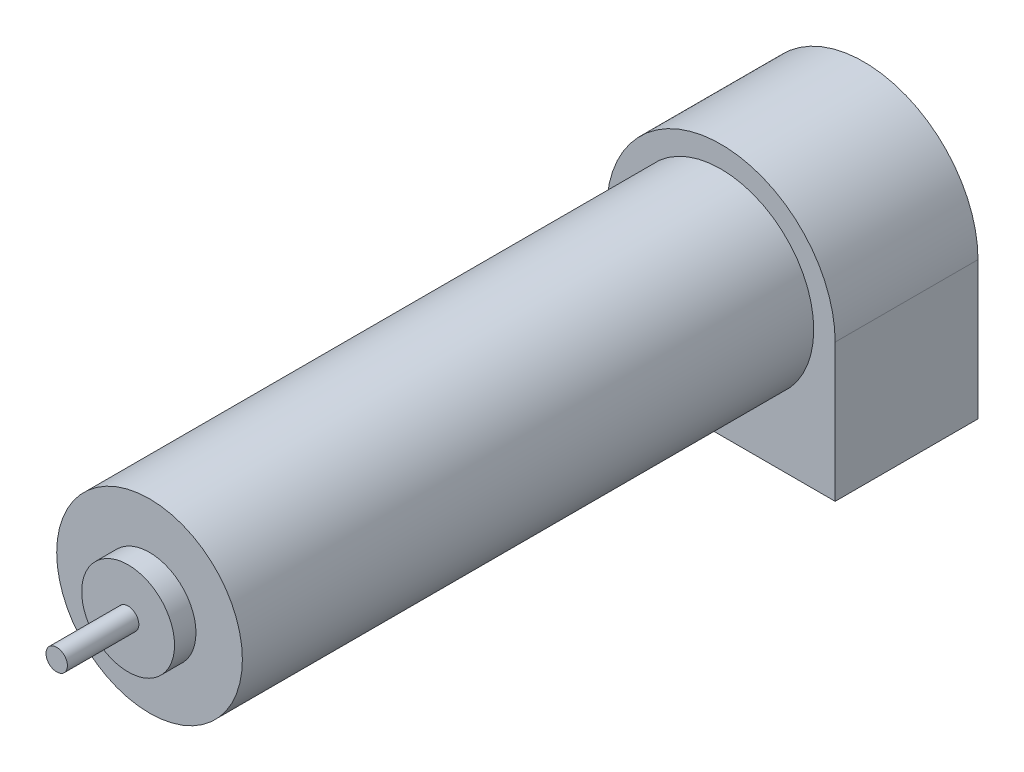
ISO-10303-21;
HEADER;
FILE_DESCRIPTION(('STEP AP214'),'2;1');
FILE_NAME('part.step','',(''),(''),'','','');
FILE_SCHEMA(('AUTOMOTIVE_DESIGN { 1 0 10303 214 1 1 1 1 }'));
ENDSEC;
DATA;
#1=APPLICATION_CONTEXT('core data for automotive mechanical design processes');
#2=APPLICATION_PROTOCOL_DEFINITION('international standard','automotive_design',2000,#1);
#3=PRODUCT_CONTEXT('',#1,'mechanical');
#4=PRODUCT('Part','Part','',(#3));
#5=PRODUCT_RELATED_PRODUCT_CATEGORY('part','',(#4));
#6=PRODUCT_DEFINITION_FORMATION('','',#4);
#7=PRODUCT_DEFINITION_CONTEXT('part definition',#1,'design');
#8=PRODUCT_DEFINITION('design','',#6,#7);
#9=PRODUCT_DEFINITION_SHAPE('','',#8);
#10=(LENGTH_UNIT() NAMED_UNIT(*) SI_UNIT(.MILLI.,.METRE.));
#11=(NAMED_UNIT(*) PLANE_ANGLE_UNIT() SI_UNIT($,.RADIAN.));
#12=(NAMED_UNIT(*) SI_UNIT($,.STERADIAN.) SOLID_ANGLE_UNIT());
#13=UNCERTAINTY_MEASURE_WITH_UNIT(LENGTH_MEASURE(1.E-05),#10,'distance_accuracy_value','');
#14=(GEOMETRIC_REPRESENTATION_CONTEXT(3) GLOBAL_UNCERTAINTY_ASSIGNED_CONTEXT((#13)) GLOBAL_UNIT_ASSIGNED_CONTEXT((#10,
#11,#12)) REPRESENTATION_CONTEXT('',''));
#15=CARTESIAN_POINT('',(0.,0.,0.));
#16=DIRECTION('',(0.,0.,1.));
#17=DIRECTION('',(1.,0.,0.));
#18=AXIS2_PLACEMENT_3D('',#15,#16,#17);
#19=CARTESIAN_POINT('',(0.,0.,83.));
#20=DIRECTION('',(0.,0.,1.));
#21=DIRECTION('',(1.,0.,0.));
#22=AXIS2_PLACEMENT_3D('',#19,#20,#21);
#23=PLANE('',#22);
#24=CARTESIAN_POINT('',(0.,0.,83.));
#25=DIRECTION('',(0.,0.,1.));
#26=DIRECTION('',(1.,0.,0.));
#27=AXIS2_PLACEMENT_3D('',#24,#25,#26);
#28=CIRCLE('',#27,6.5);
#29=CARTESIAN_POINT('',(6.5,0.,83.));
#30=VERTEX_POINT('',#29);
#31=EDGE_CURVE('E40',#30,#30,#28,.T.);
#32=ORIENTED_EDGE('',*,*,#31,.T.);
#33=EDGE_LOOP('',(#32));
#34=FACE_BOUND('',#33,.T.);
#35=CARTESIAN_POINT('',(0.,0.,83.));
#36=DIRECTION('',(0.,0.,1.));
#37=DIRECTION('',(1.,0.,0.));
#38=AXIS2_PLACEMENT_3D('',#35,#36,#37);
#39=CIRCLE('',#38,1.5);
#40=CARTESIAN_POINT('',(1.5,0.,83.));
#41=VERTEX_POINT('',#40);
#42=EDGE_CURVE('E111',#41,#41,#39,.T.);
#43=ORIENTED_EDGE('',*,*,#42,.F.);
#44=EDGE_LOOP('',(#43));
#45=FACE_BOUND('',#44,.T.);
#46=ADVANCED_FACE('F31',(#34,#45),#23,.T.);
#47=CARTESIAN_POINT('',(0.,0.,80.));
#48=DIRECTION('',(0.,0.,1.));
#49=DIRECTION('',(1.,0.,0.));
#50=AXIS2_PLACEMENT_3D('',#47,#48,#49);
#51=PLANE('',#50);
#52=CARTESIAN_POINT('',(0.,0.,80.));
#53=DIRECTION('',(0.,0.,1.));
#54=DIRECTION('',(1.,0.,0.));
#55=AXIS2_PLACEMENT_3D('',#52,#53,#54);
#56=CIRCLE('',#55,13.);
#57=CARTESIAN_POINT('',(13.,0.,80.));
#58=VERTEX_POINT('',#57);
#59=EDGE_CURVE('E11',#58,#58,#56,.T.);
#60=ORIENTED_EDGE('',*,*,#59,.T.);
#61=EDGE_LOOP('',(#60));
#62=FACE_BOUND('',#61,.T.);
#63=CARTESIAN_POINT('',(0.,0.,80.));
#64=DIRECTION('',(0.,0.,1.));
#65=DIRECTION('',(1.,0.,0.));
#66=AXIS2_PLACEMENT_3D('',#63,#64,#65);
#67=CIRCLE('',#66,6.5);
#68=CARTESIAN_POINT('',(6.5,0.,80.));
#69=VERTEX_POINT('',#68);
#70=EDGE_CURVE('E115',#69,#69,#67,.T.);
#71=ORIENTED_EDGE('',*,*,#70,.F.);
#72=EDGE_LOOP('',(#71));
#73=FACE_BOUND('',#72,.T.);
#74=ADVANCED_FACE('F124',(#62,#73),#51,.T.);
#75=CARTESIAN_POINT('',(0.,0.,80.));
#76=DIRECTION('',(0.,0.,-1.));
#77=DIRECTION('',(-1.,0.,0.));
#78=AXIS2_PLACEMENT_3D('',#75,#76,#77);
#79=CYLINDRICAL_SURFACE('',#78,13.);
#80=ORIENTED_EDGE('',*,*,#59,.F.);
#81=EDGE_LOOP('',(#80));
#82=FACE_BOUND('',#81,.T.);
#83=CARTESIAN_POINT('',(0.,0.,0.));
#84=DIRECTION('',(0.,0.,-1.));
#85=DIRECTION('',(-1.,0.,0.));
#86=AXIS2_PLACEMENT_3D('',#83,#84,#85);
#87=CIRCLE('',#86,13.);
#88=CARTESIAN_POINT('',(-13.,0.,0.));
#89=VERTEX_POINT('',#88);
#90=EDGE_CURVE('E108',#89,#89,#87,.T.);
#91=ORIENTED_EDGE('',*,*,#90,.F.);
#92=EDGE_LOOP('',(#91));
#93=FACE_BOUND('',#92,.T.);
#94=ADVANCED_FACE('F33',(#82,#93),#79,.T.);
#95=CARTESIAN_POINT('',(0.,0.,83.));
#96=DIRECTION('',(0.,0.,-1.));
#97=DIRECTION('',(-1.,0.,0.));
#98=AXIS2_PLACEMENT_3D('',#95,#96,#97);
#99=CYLINDRICAL_SURFACE('',#98,6.5);
#100=ORIENTED_EDGE('',*,*,#31,.F.);
#101=EDGE_LOOP('',(#100));
#102=FACE_BOUND('',#101,.T.);
#103=ORIENTED_EDGE('',*,*,#70,.T.);
#104=EDGE_LOOP('',(#103));
#105=FACE_BOUND('',#104,.T.);
#106=ADVANCED_FACE('F122',(#102,#105),#99,.T.);
#107=CARTESIAN_POINT('',(0.,0.,93.));
#108=DIRECTION('',(0.,0.,-1.));
#109=DIRECTION('',(-1.,0.,0.));
#110=AXIS2_PLACEMENT_3D('',#107,#108,#109);
#111=CYLINDRICAL_SURFACE('',#110,1.5);
#112=CARTESIAN_POINT('',(0.,0.,93.));
#113=DIRECTION('',(0.,0.,1.));
#114=DIRECTION('',(1.,0.,0.));
#115=AXIS2_PLACEMENT_3D('',#112,#113,#114);
#116=CIRCLE('',#115,1.5);
#117=CARTESIAN_POINT('',(1.5,0.,93.));
#118=VERTEX_POINT('',#117);
#119=EDGE_CURVE('E112',#118,#118,#116,.T.);
#120=ORIENTED_EDGE('',*,*,#119,.F.);
#121=EDGE_LOOP('',(#120));
#122=FACE_BOUND('',#121,.T.);
#123=ORIENTED_EDGE('',*,*,#42,.T.);
#124=EDGE_LOOP('',(#123));
#125=FACE_BOUND('',#124,.T.);
#126=ADVANCED_FACE('F136',(#122,#125),#111,.T.);
#127=CARTESIAN_POINT('',(0.,0.,93.));
#128=DIRECTION('',(0.,0.,1.));
#129=DIRECTION('',(1.,0.,0.));
#130=AXIS2_PLACEMENT_3D('',#127,#128,#129);
#131=PLANE('',#130);
#132=ORIENTED_EDGE('',*,*,#119,.T.);
#133=EDGE_LOOP('',(#132));
#134=FACE_BOUND('',#133,.T.);
#135=ADVANCED_FACE('F141',(#134),#131,.T.);
#136=CARTESIAN_POINT('',(0.,0.,0.));
#137=DIRECTION('',(0.,0.,-1.));
#138=DIRECTION('',(-1.,0.,0.));
#139=AXIS2_PLACEMENT_3D('',#136,#137,#138);
#140=PLANE('',#139);
#141=CARTESIAN_POINT('',(0.,0.,0.));
#142=DIRECTION('',(0.,0.,-1.));
#143=DIRECTION('',(-1.,0.,0.));
#144=AXIS2_PLACEMENT_3D('',#141,#142,#143);
#145=CIRCLE('',#144,16.);
#146=CARTESIAN_POINT('',(-16.,0.,0.));
#147=VERTEX_POINT('',#146);
#148=CARTESIAN_POINT('',(16.,0.,0.));
#149=VERTEX_POINT('',#148);
#150=EDGE_CURVE('E99',#147,#149,#145,.T.);
#151=ORIENTED_EDGE('',*,*,#150,.F.);
#152=DIRECTION('',(0.,1.,0.));
#153=VECTOR('',#152,1.);
#154=CARTESIAN_POINT('',(-16.,-19.313261221896,0.));
#155=LINE('',#154,#153);
#156=CARTESIAN_POINT('',(-16.,-19.313261221896,0.));
#157=VERTEX_POINT('',#156);
#158=EDGE_CURVE('E71',#157,#147,#155,.T.);
#159=ORIENTED_EDGE('',*,*,#158,.F.);
#160=DIRECTION('',(-1.,0.,0.));
#161=VECTOR('',#160,1.);
#162=CARTESIAN_POINT('',(16.,-19.313261221896,0.));
#163=LINE('',#162,#161);
#164=CARTESIAN_POINT('',(16.,-19.313261221896,0.));
#165=VERTEX_POINT('',#164);
#166=EDGE_CURVE('E65',#165,#157,#163,.T.);
#167=ORIENTED_EDGE('',*,*,#166,.F.);
#168=DIRECTION('',(0.,-1.,0.));
#169=VECTOR('',#168,1.);
#170=CARTESIAN_POINT('',(16.,0.,0.));
#171=LINE('',#170,#169);
#172=EDGE_CURVE('E89',#149,#165,#171,.T.);
#173=ORIENTED_EDGE('',*,*,#172,.F.);
#174=EDGE_LOOP('',(#151,#159,#167,#173));
#175=FACE_BOUND('',#174,.T.);
#176=ORIENTED_EDGE('',*,*,#90,.T.);
#177=EDGE_LOOP('',(#176));
#178=FACE_BOUND('',#177,.T.);
#179=ADVANCED_FACE('F145',(#175,#178),#140,.F.);
#180=CARTESIAN_POINT('',(0.,0.,-20.));
#181=DIRECTION('',(0.,0.,1.));
#182=DIRECTION('',(1.,0.,0.));
#183=AXIS2_PLACEMENT_3D('',#180,#181,#182);
#184=CYLINDRICAL_SURFACE('',#183,16.);
#185=ORIENTED_EDGE('',*,*,#150,.T.);
#186=DIRECTION('',(0.,0.,1.));
#187=VECTOR('',#186,1.);
#188=CARTESIAN_POINT('',(16.,0.,-20.));
#189=LINE('',#188,#187);
#190=CARTESIAN_POINT('',(16.,0.,-20.));
#191=VERTEX_POINT('',#190);
#192=EDGE_CURVE('E90',#191,#149,#189,.T.);
#193=ORIENTED_EDGE('',*,*,#192,.F.);
#194=CARTESIAN_POINT('',(0.,0.,-20.));
#195=DIRECTION('',(0.,0.,-1.));
#196=DIRECTION('',(-1.,0.,0.));
#197=AXIS2_PLACEMENT_3D('',#194,#195,#196);
#198=CIRCLE('',#197,16.);
#199=CARTESIAN_POINT('',(-16.,0.,-20.));
#200=VERTEX_POINT('',#199);
#201=EDGE_CURVE('E84',#200,#191,#198,.T.);
#202=ORIENTED_EDGE('',*,*,#201,.F.);
#203=DIRECTION('',(0.,0.,1.));
#204=VECTOR('',#203,1.);
#205=CARTESIAN_POINT('',(-16.,0.,-20.));
#206=LINE('',#205,#204);
#207=EDGE_CURVE('E95',#200,#147,#206,.T.);
#208=ORIENTED_EDGE('',*,*,#207,.T.);
#209=EDGE_LOOP('',(#185,#193,#202,#208));
#210=FACE_BOUND('',#209,.T.);
#211=ADVANCED_FACE('F147',(#210),#184,.T.);
#212=CARTESIAN_POINT('',(16.,0.,-20.));
#213=DIRECTION('',(-1.,0.,0.));
#214=DIRECTION('',(0.,0.,1.));
#215=AXIS2_PLACEMENT_3D('',#212,#213,#214);
#216=PLANE('',#215);
#217=ORIENTED_EDGE('',*,*,#172,.T.);
#218=DIRECTION('',(0.,0.,1.));
#219=VECTOR('',#218,1.);
#220=CARTESIAN_POINT('',(16.,-19.313261221896,-20.));
#221=LINE('',#220,#219);
#222=CARTESIAN_POINT('',(16.,-19.313261221896,-20.));
#223=VERTEX_POINT('',#222);
#224=EDGE_CURVE('E87',#223,#165,#221,.T.);
#225=ORIENTED_EDGE('',*,*,#224,.F.);
#226=DIRECTION('',(0.,-1.,0.));
#227=VECTOR('',#226,1.);
#228=CARTESIAN_POINT('',(16.,0.,-20.));
#229=LINE('',#228,#227);
#230=EDGE_CURVE('E79',#191,#223,#229,.T.);
#231=ORIENTED_EDGE('',*,*,#230,.F.);
#232=ORIENTED_EDGE('',*,*,#192,.T.);
#233=EDGE_LOOP('',(#217,#225,#231,#232));
#234=FACE_BOUND('',#233,.T.);
#235=ADVANCED_FACE('F88',(#234),#216,.F.);
#236=CARTESIAN_POINT('',(16.,-19.313261221896,-20.));
#237=DIRECTION('',(0.,1.,0.));
#238=DIRECTION('',(0.,0.,1.));
#239=AXIS2_PLACEMENT_3D('',#236,#237,#238);
#240=PLANE('',#239);
#241=ORIENTED_EDGE('',*,*,#166,.T.);
#242=DIRECTION('',(0.,0.,1.));
#243=VECTOR('',#242,1.);
#244=CARTESIAN_POINT('',(-16.,-19.313261221896,-20.));
#245=LINE('',#244,#243);
#246=CARTESIAN_POINT('',(-16.,-19.313261221896,-20.));
#247=VERTEX_POINT('',#246);
#248=EDGE_CURVE('E91',#247,#157,#245,.T.);
#249=ORIENTED_EDGE('',*,*,#248,.F.);
#250=DIRECTION('',(-1.,0.,0.));
#251=VECTOR('',#250,1.);
#252=CARTESIAN_POINT('',(16.,-19.313261221896,-20.));
#253=LINE('',#252,#251);
#254=EDGE_CURVE('E82',#223,#247,#253,.T.);
#255=ORIENTED_EDGE('',*,*,#254,.F.);
#256=ORIENTED_EDGE('',*,*,#224,.T.);
#257=EDGE_LOOP('',(#241,#249,#255,#256));
#258=FACE_BOUND('',#257,.T.);
#259=ADVANCED_FACE('F93',(#258),#240,.F.);
#260=CARTESIAN_POINT('',(-16.,-19.313261221896,-20.));
#261=DIRECTION('',(1.,0.,0.));
#262=DIRECTION('',(0.,0.,-1.));
#263=AXIS2_PLACEMENT_3D('',#260,#261,#262);
#264=PLANE('',#263);
#265=ORIENTED_EDGE('',*,*,#158,.T.);
#266=ORIENTED_EDGE('',*,*,#207,.F.);
#267=DIRECTION('',(0.,1.,0.));
#268=VECTOR('',#267,1.);
#269=CARTESIAN_POINT('',(-16.,-19.313261221896,-20.));
#270=LINE('',#269,#268);
#271=EDGE_CURVE('E48',#247,#200,#270,.T.);
#272=ORIENTED_EDGE('',*,*,#271,.F.);
#273=ORIENTED_EDGE('',*,*,#248,.T.);
#274=EDGE_LOOP('',(#265,#266,#272,#273));
#275=FACE_BOUND('',#274,.T.);
#276=ADVANCED_FACE('F155',(#275),#264,.F.);
#277=CARTESIAN_POINT('',(0.,0.,-20.));
#278=DIRECTION('',(0.,0.,-1.));
#279=DIRECTION('',(-1.,0.,0.));
#280=AXIS2_PLACEMENT_3D('',#277,#278,#279);
#281=PLANE('',#280);
#282=ORIENTED_EDGE('',*,*,#201,.T.);
#283=ORIENTED_EDGE('',*,*,#230,.T.);
#284=ORIENTED_EDGE('',*,*,#254,.T.);
#285=ORIENTED_EDGE('',*,*,#271,.T.);
#286=EDGE_LOOP('',(#282,#283,#284,#285));
#287=FACE_BOUND('',#286,.T.);
#288=ADVANCED_FACE('F80',(#287),#281,.T.);
#289=CLOSED_SHELL('',(#46,#74,#94,#106,#126,#135,#179,#211,#235,#259,#276,#288));
#290=MANIFOLD_SOLID_BREP('B2',#289);
#291=ADVANCED_BREP_SHAPE_REPRESENTATION('',(#18,#290),#14);
#292=SHAPE_DEFINITION_REPRESENTATION(#9,#291);
ENDSEC;
END-ISO-10303-21;
